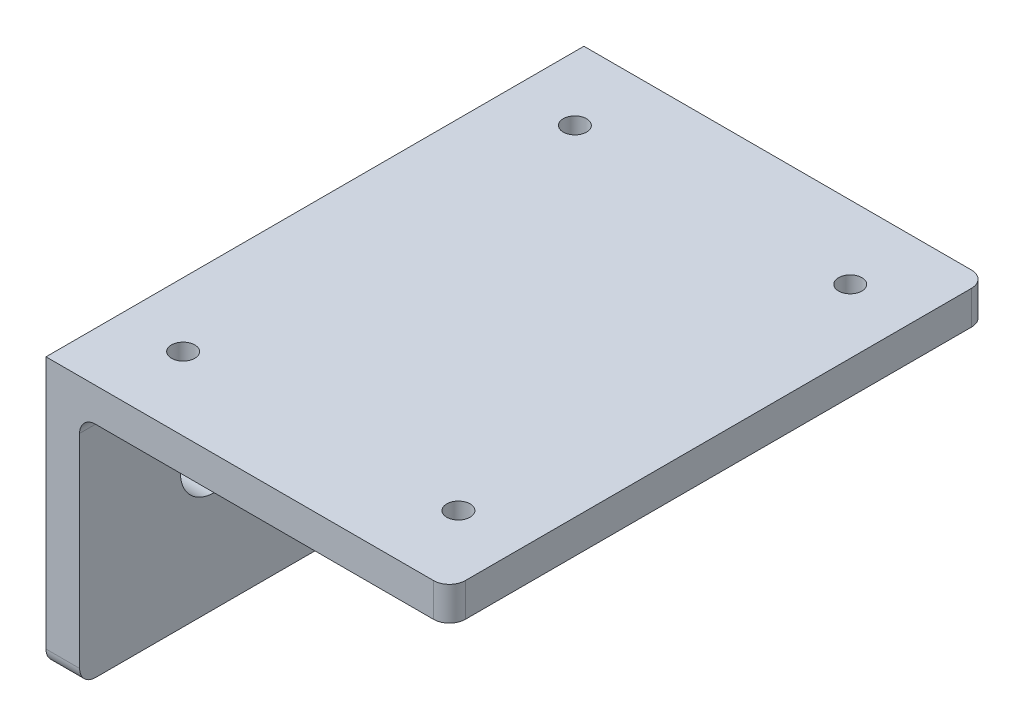
ISO-10303-21;
HEADER;
FILE_DESCRIPTION(('STEP AP214'),'2;1');
FILE_NAME('part.step','',(''),(''),'','','');
FILE_SCHEMA(('AUTOMOTIVE_DESIGN { 1 0 10303 214 1 1 1 1 }'));
ENDSEC;
DATA;
#1=APPLICATION_CONTEXT('core data for automotive mechanical design processes');
#2=APPLICATION_PROTOCOL_DEFINITION('international standard','automotive_design',2000,#1);
#3=PRODUCT_CONTEXT('',#1,'mechanical');
#4=PRODUCT('Part','Part','',(#3));
#5=PRODUCT_RELATED_PRODUCT_CATEGORY('part','',(#4));
#6=PRODUCT_DEFINITION_FORMATION('','',#4);
#7=PRODUCT_DEFINITION_CONTEXT('part definition',#1,'design');
#8=PRODUCT_DEFINITION('design','',#6,#7);
#9=PRODUCT_DEFINITION_SHAPE('','',#8);
#10=(LENGTH_UNIT() NAMED_UNIT(*) SI_UNIT(.MILLI.,.METRE.));
#11=(NAMED_UNIT(*) PLANE_ANGLE_UNIT() SI_UNIT($,.RADIAN.));
#12=(NAMED_UNIT(*) SI_UNIT($,.STERADIAN.) SOLID_ANGLE_UNIT());
#13=UNCERTAINTY_MEASURE_WITH_UNIT(LENGTH_MEASURE(1.E-05),#10,'distance_accuracy_value','');
#14=(GEOMETRIC_REPRESENTATION_CONTEXT(3) GLOBAL_UNCERTAINTY_ASSIGNED_CONTEXT((#13)) GLOBAL_UNIT_ASSIGNED_CONTEXT((#10,
#11,#12)) REPRESENTATION_CONTEXT('',''));
#15=CARTESIAN_POINT('',(0.,0.,0.));
#16=DIRECTION('',(0.,0.,1.));
#17=DIRECTION('',(1.,0.,0.));
#18=AXIS2_PLACEMENT_3D('',#15,#16,#17);
#19=CARTESIAN_POINT('',(3.175,0.,0.));
#20=DIRECTION('',(-1.,0.,0.));
#21=DIRECTION('',(0.,0.,1.));
#22=AXIS2_PLACEMENT_3D('',#19,#20,#21);
#23=PLANE('',#22);
#24=CARTESIAN_POINT('',(3.175,0.,12.7));
#25=DIRECTION('',(-1.,0.,0.));
#26=DIRECTION('',(0.,0.,1.));
#27=AXIS2_PLACEMENT_3D('',#24,#25,#26);
#28=CIRCLE('',#27,3.175);
#29=CARTESIAN_POINT('',(3.175,0.,15.875));
#30=VERTEX_POINT('',#29);
#31=EDGE_CURVE('E260',#30,#30,#28,.T.);
#32=ORIENTED_EDGE('',*,*,#31,.T.);
#33=EDGE_LOOP('',(#32));
#34=FACE_BOUND('',#33,.T.);
#35=DIRECTION('',(0.,-1.,0.));
#36=VECTOR('',#35,1.);
#37=CARTESIAN_POINT('',(3.175,-12.7,25.4));
#38=LINE('',#37,#36);
#39=CARTESIAN_POINT('',(3.175,8.02500000000001,25.4));
#40=VERTEX_POINT('',#39);
#41=CARTESIAN_POINT('',(3.175,-11.2,25.4));
#42=VERTEX_POINT('',#41);
#43=EDGE_CURVE('E304',#40,#42,#38,.T.);
#44=ORIENTED_EDGE('',*,*,#43,.T.);
#45=CARTESIAN_POINT('',(3.175,-11.2,23.9));
#46=DIRECTION('',(-1.,0.,0.));
#47=DIRECTION('',(0.,0.,1.));
#48=AXIS2_PLACEMENT_3D('',#45,#46,#47);
#49=CIRCLE('',#48,1.5);
#50=CARTESIAN_POINT('',(3.175,-12.7,23.9));
#51=VERTEX_POINT('',#50);
#52=EDGE_CURVE('E343',#42,#51,#49,.F.);
#53=ORIENTED_EDGE('',*,*,#52,.T.);
#54=DIRECTION('',(0.,0.,-1.));
#55=VECTOR('',#54,1.);
#56=CARTESIAN_POINT('',(3.175,-12.7,25.4));
#57=LINE('',#56,#55);
#58=CARTESIAN_POINT('',(3.175,-12.7,3.0875));
#59=VERTEX_POINT('',#58);
#60=EDGE_CURVE('E309',#51,#59,#57,.T.);
#61=ORIENTED_EDGE('',*,*,#60,.T.);
#62=DIRECTION('',(0.,-1.,0.));
#63=VECTOR('',#62,1.);
#64=CARTESIAN_POINT('',(3.175,9.52500000000001,3.0875));
#65=LINE('',#64,#63);
#66=CARTESIAN_POINT('',(3.175,8.02500000000001,3.0875));
#67=VERTEX_POINT('',#66);
#68=EDGE_CURVE('E339',#59,#67,#65,.F.);
#69=ORIENTED_EDGE('',*,*,#68,.T.);
#70=DIRECTION('',(0.,0.,-1.));
#71=VECTOR('',#70,1.);
#72=CARTESIAN_POINT('',(3.175,8.02500000000001,25.4));
#73=LINE('',#72,#71);
#74=EDGE_CURVE('E341',#67,#40,#73,.F.);
#75=ORIENTED_EDGE('',*,*,#74,.T.);
#76=EDGE_LOOP('',(#44,#53,#61,#69,#75));
#77=FACE_BOUND('',#76,.T.);
#78=ADVANCED_FACE('F32',(#34,#77),#23,.F.);
#79=CARTESIAN_POINT('',(0.,9.52500000000001,0.));
#80=DIRECTION('',(0.,1.,0.));
#81=DIRECTION('',(0.,0.,1.));
#82=AXIS2_PLACEMENT_3D('',#79,#80,#81);
#83=PLANE('',#82);
#84=CARTESIAN_POINT('',(32.05,9.52500000000001,-18.5));
#85=DIRECTION('',(0.,1.,0.));
#86=DIRECTION('',(0.,0.,1.));
#87=AXIS2_PLACEMENT_3D('',#84,#85,#86);
#88=CIRCLE('',#87,1.1);
#89=CARTESIAN_POINT('',(32.05,9.52500000000001,-17.4));
#90=VERTEX_POINT('',#89);
#91=EDGE_CURVE('E283',#90,#90,#88,.T.);
#92=ORIENTED_EDGE('',*,*,#91,.T.);
#93=EDGE_LOOP('',(#92));
#94=FACE_BOUND('',#93,.T.);
#95=CARTESIAN_POINT('',(6.05000000000001,9.52500000000001,18.5));
#96=DIRECTION('',(0.,1.,0.));
#97=DIRECTION('',(0.,0.,1.));
#98=AXIS2_PLACEMENT_3D('',#95,#96,#97);
#99=CIRCLE('',#98,1.1);
#100=CARTESIAN_POINT('',(6.05000000000001,9.52500000000001,19.6));
#101=VERTEX_POINT('',#100);
#102=EDGE_CURVE('E265',#101,#101,#99,.T.);
#103=ORIENTED_EDGE('',*,*,#102,.T.);
#104=EDGE_LOOP('',(#103));
#105=FACE_BOUND('',#104,.T.);
#106=CARTESIAN_POINT('',(32.05,9.52500000000001,18.5));
#107=DIRECTION('',(0.,1.,0.));
#108=DIRECTION('',(0.,0.,1.));
#109=AXIS2_PLACEMENT_3D('',#106,#107,#108);
#110=CIRCLE('',#109,1.1);
#111=CARTESIAN_POINT('',(32.05,9.52500000000001,19.6));
#112=VERTEX_POINT('',#111);
#113=EDGE_CURVE('E278',#112,#112,#110,.T.);
#114=ORIENTED_EDGE('',*,*,#113,.T.);
#115=EDGE_LOOP('',(#114));
#116=FACE_BOUND('',#115,.T.);
#117=CARTESIAN_POINT('',(6.05000000000001,9.52500000000001,-18.5));
#118=DIRECTION('',(0.,1.,0.));
#119=DIRECTION('',(0.,0.,1.));
#120=AXIS2_PLACEMENT_3D('',#117,#118,#119);
#121=CIRCLE('',#120,1.1);
#122=CARTESIAN_POINT('',(6.05000000000001,9.52500000000001,-17.4));
#123=VERTEX_POINT('',#122);
#124=EDGE_CURVE('E271',#123,#123,#121,.T.);
#125=ORIENTED_EDGE('',*,*,#124,.T.);
#126=EDGE_LOOP('',(#125));
#127=FACE_BOUND('',#126,.T.);
#128=DIRECTION('',(0.,0.,-1.));
#129=VECTOR('',#128,1.);
#130=CARTESIAN_POINT('',(38.1,9.52500000000001,-25.4));
#131=LINE('',#130,#129);
#132=CARTESIAN_POINT('',(38.1,9.52500000000001,23.9));
#133=VERTEX_POINT('',#132);
#134=CARTESIAN_POINT('',(38.1,9.52500000000001,-23.9));
#135=VERTEX_POINT('',#134);
#136=EDGE_CURVE('E292',#133,#135,#131,.T.);
#137=ORIENTED_EDGE('',*,*,#136,.F.);
#138=CARTESIAN_POINT('',(36.6,9.52500000000001,23.9));
#139=DIRECTION('',(0.,1.,0.));
#140=DIRECTION('',(0.,0.,1.));
#141=AXIS2_PLACEMENT_3D('',#138,#139,#140);
#142=CIRCLE('',#141,1.5);
#143=CARTESIAN_POINT('',(36.6,9.52500000000001,25.4));
#144=VERTEX_POINT('',#143);
#145=EDGE_CURVE('E374',#133,#144,#142,.F.);
#146=ORIENTED_EDGE('',*,*,#145,.T.);
#147=DIRECTION('',(1.,0.,0.));
#148=VECTOR('',#147,1.);
#149=CARTESIAN_POINT('',(0.,9.52500000000001,25.4));
#150=LINE('',#149,#148);
#151=CARTESIAN_POINT('',(4.675,9.52500000000001,25.4));
#152=VERTEX_POINT('',#151);
#153=EDGE_CURVE('E289',#152,#144,#150,.T.);
#154=ORIENTED_EDGE('',*,*,#153,.F.);
#155=DIRECTION('',(0.,0.,-1.));
#156=VECTOR('',#155,1.);
#157=CARTESIAN_POINT('',(4.675,9.52500000000001,1.5875));
#158=LINE('',#157,#156);
#159=CARTESIAN_POINT('',(4.675,9.52500000000001,3.0875));
#160=VERTEX_POINT('',#159);
#161=EDGE_CURVE('E366',#152,#160,#158,.T.);
#162=ORIENTED_EDGE('',*,*,#161,.T.);
#163=DIRECTION('',(-1.,0.,0.));
#164=VECTOR('',#163,1.);
#165=CARTESIAN_POINT('',(25.3999999999999,9.52500000000001,3.0875));
#166=LINE('',#165,#164);
#167=CARTESIAN_POINT('',(26.0213203435596,9.52500000000001,3.0875));
#168=VERTEX_POINT('',#167);
#169=EDGE_CURVE('E196',#160,#168,#166,.F.);
#170=ORIENTED_EDGE('',*,*,#169,.T.);
#171=DIRECTION('',(0.,0.,-1.));
#172=VECTOR('',#171,1.);
#173=CARTESIAN_POINT('',(26.0213203435596,9.52500000000001,-1.5875));
#174=LINE('',#173,#172);
#175=CARTESIAN_POINT('',(26.0213203435596,9.52500000000001,-3.0875));
#176=VERTEX_POINT('',#175);
#177=EDGE_CURVE('E246',#168,#176,#174,.T.);
#178=ORIENTED_EDGE('',*,*,#177,.T.);
#179=DIRECTION('',(-1.,0.,0.));
#180=VECTOR('',#179,1.);
#181=CARTESIAN_POINT('',(0.,9.52500000000001,-3.0875));
#182=LINE('',#181,#180);
#183=CARTESIAN_POINT('',(4.675,9.52500000000001,-3.0875));
#184=VERTEX_POINT('',#183);
#185=EDGE_CURVE('E222',#176,#184,#182,.T.);
#186=ORIENTED_EDGE('',*,*,#185,.T.);
#187=DIRECTION('',(0.,0.,-1.));
#188=VECTOR('',#187,1.);
#189=CARTESIAN_POINT('',(4.675,9.52500000000001,-25.4));
#190=LINE('',#189,#188);
#191=CARTESIAN_POINT('',(4.675,9.52500000000001,-25.4));
#192=VERTEX_POINT('',#191);
#193=EDGE_CURVE('E370',#184,#192,#190,.T.);
#194=ORIENTED_EDGE('',*,*,#193,.T.);
#195=DIRECTION('',(-1.,0.,0.));
#196=VECTOR('',#195,1.);
#197=CARTESIAN_POINT('',(0.,9.52500000000001,-25.4));
#198=LINE('',#197,#196);
#199=CARTESIAN_POINT('',(36.6,9.52500000000001,-25.4));
#200=VERTEX_POINT('',#199);
#201=EDGE_CURVE('E295',#200,#192,#198,.T.);
#202=ORIENTED_EDGE('',*,*,#201,.F.);
#203=CARTESIAN_POINT('',(36.6,9.52500000000001,-23.9));
#204=DIRECTION('',(0.,1.,0.));
#205=DIRECTION('',(0.,0.,1.));
#206=AXIS2_PLACEMENT_3D('',#203,#204,#205);
#207=CIRCLE('',#206,1.5);
#208=EDGE_CURVE('E372',#200,#135,#207,.F.);
#209=ORIENTED_EDGE('',*,*,#208,.T.);
#210=EDGE_LOOP('',(#137,#146,#154,#162,#170,#178,#186,#194,#202,#209));
#211=FACE_BOUND('',#210,.T.);
#212=ADVANCED_FACE('F379',(#94,#105,#116,#127,#211),#83,.F.);
#213=CARTESIAN_POINT('',(3.175,0.,-12.7));
#214=DIRECTION('',(-1.,0.,0.));
#215=DIRECTION('',(0.,0.,1.));
#216=AXIS2_PLACEMENT_3D('',#213,#214,#215);
#217=CIRCLE('',#216,3.175);
#218=CARTESIAN_POINT('',(3.175,0.,-9.525));
#219=VERTEX_POINT('',#218);
#220=EDGE_CURVE('E253',#219,#219,#217,.T.);
#221=ORIENTED_EDGE('',*,*,#220,.T.);
#222=EDGE_LOOP('',(#221));
#223=FACE_BOUND('',#222,.T.);
#224=CARTESIAN_POINT('',(3.175,-12.7,-3.0875));
#225=VERTEX_POINT('',#224);
#226=CARTESIAN_POINT('',(3.175,-12.7,-23.9));
#227=VERTEX_POINT('',#226);
#228=EDGE_CURVE('E308',#225,#227,#57,.T.);
#229=ORIENTED_EDGE('',*,*,#228,.T.);
#230=CARTESIAN_POINT('',(3.175,-11.2,-23.9));
#231=DIRECTION('',(-1.,0.,0.));
#232=DIRECTION('',(0.,0.,1.));
#233=AXIS2_PLACEMENT_3D('',#230,#231,#232);
#234=CIRCLE('',#233,1.5);
#235=CARTESIAN_POINT('',(3.175,-11.2,-25.4));
#236=VERTEX_POINT('',#235);
#237=EDGE_CURVE('E354',#227,#236,#234,.F.);
#238=ORIENTED_EDGE('',*,*,#237,.T.);
#239=DIRECTION('',(0.,1.,0.));
#240=VECTOR('',#239,1.);
#241=CARTESIAN_POINT('',(3.175,-12.7,-25.4));
#242=LINE('',#241,#240);
#243=CARTESIAN_POINT('',(3.175,8.02500000000001,-25.4));
#244=VERTEX_POINT('',#243);
#245=EDGE_CURVE('E301',#236,#244,#242,.T.);
#246=ORIENTED_EDGE('',*,*,#245,.T.);
#247=DIRECTION('',(0.,0.,-1.));
#248=VECTOR('',#247,1.);
#249=CARTESIAN_POINT('',(3.175,8.02500000000001,-1.5875));
#250=LINE('',#249,#248);
#251=CARTESIAN_POINT('',(3.175,8.02500000000001,-3.0875));
#252=VERTEX_POINT('',#251);
#253=EDGE_CURVE('E350',#244,#252,#250,.F.);
#254=ORIENTED_EDGE('',*,*,#253,.T.);
#255=DIRECTION('',(0.,-1.,0.));
#256=VECTOR('',#255,1.);
#257=CARTESIAN_POINT('',(3.175,0.,-3.0875));
#258=LINE('',#257,#256);
#259=EDGE_CURVE('E352',#252,#225,#258,.T.);
#260=ORIENTED_EDGE('',*,*,#259,.T.);
#261=EDGE_LOOP('',(#229,#238,#246,#254,#260));
#262=FACE_BOUND('',#261,.T.);
#263=ADVANCED_FACE('F424',(#223,#262),#23,.F.);
#264=CARTESIAN_POINT('',(3.175,-12.7,-25.4));
#265=DIRECTION('',(0.,0.,1.));
#266=DIRECTION('',(1.,0.,0.));
#267=AXIS2_PLACEMENT_3D('',#264,#265,#266);
#268=PLANE('',#267);
#269=ORIENTED_EDGE('',*,*,#245,.F.);
#270=DIRECTION('',(-1.,0.,0.));
#271=VECTOR('',#270,1.);
#272=CARTESIAN_POINT('',(3.175,-11.2,-25.4));
#273=LINE('',#272,#271);
#274=CARTESIAN_POINT('',(0.,-11.2,-25.4));
#275=VERTEX_POINT('',#274);
#276=EDGE_CURVE('E347',#236,#275,#273,.T.);
#277=ORIENTED_EDGE('',*,*,#276,.T.);
#278=DIRECTION('',(0.,1.,0.));
#279=VECTOR('',#278,1.);
#280=CARTESIAN_POINT('',(0.,-12.7,-25.4));
#281=LINE('',#280,#279);
#282=CARTESIAN_POINT('',(0.,12.7,-25.4));
#283=VERTEX_POINT('',#282);
#284=EDGE_CURVE('E298',#275,#283,#281,.T.);
#285=ORIENTED_EDGE('',*,*,#284,.T.);
#286=DIRECTION('',(-1.,0.,0.));
#287=VECTOR('',#286,1.);
#288=CARTESIAN_POINT('',(3.175,12.7,-25.4));
#289=LINE('',#288,#287);
#290=CARTESIAN_POINT('',(36.6,12.7,-25.4));
#291=VERTEX_POINT('',#290);
#292=EDGE_CURVE('E323',#291,#283,#289,.T.);
#293=ORIENTED_EDGE('',*,*,#292,.F.);
#294=DIRECTION('',(0.,1.,0.));
#295=VECTOR('',#294,1.);
#296=CARTESIAN_POINT('',(36.6,9.52500000000001,-25.4));
#297=LINE('',#296,#295);
#298=EDGE_CURVE('E345',#291,#200,#297,.F.);
#299=ORIENTED_EDGE('',*,*,#298,.T.);
#300=ORIENTED_EDGE('',*,*,#201,.T.);
#301=CARTESIAN_POINT('',(4.675,8.02500000000001,-25.4));
#302=DIRECTION('',(0.,0.,1.));
#303=DIRECTION('',(1.,0.,0.));
#304=AXIS2_PLACEMENT_3D('',#301,#302,#303);
#305=CIRCLE('',#304,1.5);
#306=EDGE_CURVE('E236',#192,#244,#305,.T.);
#307=ORIENTED_EDGE('',*,*,#306,.T.);
#308=EDGE_LOOP('',(#269,#277,#285,#293,#299,#300,#307));
#309=FACE_BOUND('',#308,.T.);
#310=ADVANCED_FACE('F404',(#309),#268,.F.);
#311=CARTESIAN_POINT('',(3.175,12.7,25.4));
#312=DIRECTION('',(0.,-1.,0.));
#313=DIRECTION('',(0.,0.,-1.));
#314=AXIS2_PLACEMENT_3D('',#311,#312,#313);
#315=PLANE('',#314);
#316=CARTESIAN_POINT('',(6.05000000000001,12.7,-18.5));
#317=DIRECTION('',(0.,1.,0.));
#318=DIRECTION('',(0.,0.,1.));
#319=AXIS2_PLACEMENT_3D('',#316,#317,#318);
#320=CIRCLE('',#319,1.1);
#321=CARTESIAN_POINT('',(6.05000000000001,12.7,-17.4));
#322=VERTEX_POINT('',#321);
#323=EDGE_CURVE('E275',#322,#322,#320,.T.);
#324=ORIENTED_EDGE('',*,*,#323,.F.);
#325=EDGE_LOOP('',(#324));
#326=FACE_BOUND('',#325,.T.);
#327=CARTESIAN_POINT('',(32.05,12.7,18.5));
#328=DIRECTION('',(0.,1.,0.));
#329=DIRECTION('',(0.,0.,1.));
#330=AXIS2_PLACEMENT_3D('',#327,#328,#329);
#331=CIRCLE('',#330,1.1);
#332=CARTESIAN_POINT('',(32.05,12.7,19.6));
#333=VERTEX_POINT('',#332);
#334=EDGE_CURVE('E268',#333,#333,#331,.T.);
#335=ORIENTED_EDGE('',*,*,#334,.F.);
#336=EDGE_LOOP('',(#335));
#337=FACE_BOUND('',#336,.T.);
#338=CARTESIAN_POINT('',(6.05000000000001,12.7,18.5));
#339=DIRECTION('',(0.,1.,0.));
#340=DIRECTION('',(0.,0.,1.));
#341=AXIS2_PLACEMENT_3D('',#338,#339,#340);
#342=CIRCLE('',#341,1.1);
#343=CARTESIAN_POINT('',(6.05000000000001,12.7,19.6));
#344=VERTEX_POINT('',#343);
#345=EDGE_CURVE('E256',#344,#344,#342,.T.);
#346=ORIENTED_EDGE('',*,*,#345,.F.);
#347=EDGE_LOOP('',(#346));
#348=FACE_BOUND('',#347,.T.);
#349=CARTESIAN_POINT('',(32.05,12.7,-18.5));
#350=DIRECTION('',(0.,1.,0.));
#351=DIRECTION('',(0.,0.,1.));
#352=AXIS2_PLACEMENT_3D('',#349,#350,#351);
#353=CIRCLE('',#352,1.1);
#354=CARTESIAN_POINT('',(32.05,12.7,-17.4));
#355=VERTEX_POINT('',#354);
#356=EDGE_CURVE('E274',#355,#355,#353,.T.);
#357=ORIENTED_EDGE('',*,*,#356,.F.);
#358=EDGE_LOOP('',(#357));
#359=FACE_BOUND('',#358,.T.);
#360=DIRECTION('',(-1.,0.,0.));
#361=VECTOR('',#360,1.);
#362=CARTESIAN_POINT('',(3.175,12.7,25.4));
#363=LINE('',#362,#361);
#364=CARTESIAN_POINT('',(36.6,12.7,25.4));
#365=VERTEX_POINT('',#364);
#366=CARTESIAN_POINT('',(0.,12.7,25.4));
#367=VERTEX_POINT('',#366);
#368=EDGE_CURVE('E311',#365,#367,#363,.T.);
#369=ORIENTED_EDGE('',*,*,#368,.F.);
#370=CARTESIAN_POINT('',(36.6,12.7,23.9));
#371=DIRECTION('',(0.,-1.,0.));
#372=DIRECTION('',(0.,0.,-1.));
#373=AXIS2_PLACEMENT_3D('',#370,#371,#372);
#374=CIRCLE('',#373,1.5);
#375=CARTESIAN_POINT('',(38.1,12.7,23.9));
#376=VERTEX_POINT('',#375);
#377=EDGE_CURVE('E358',#365,#376,#374,.F.);
#378=ORIENTED_EDGE('',*,*,#377,.T.);
#379=DIRECTION('',(0.,0.,-1.));
#380=VECTOR('',#379,1.);
#381=CARTESIAN_POINT('',(38.1,12.7,-25.4));
#382=LINE('',#381,#380);
#383=CARTESIAN_POINT('',(38.1,12.7,-23.9));
#384=VERTEX_POINT('',#383);
#385=EDGE_CURVE('E286',#376,#384,#382,.T.);
#386=ORIENTED_EDGE('',*,*,#385,.T.);
#387=CARTESIAN_POINT('',(36.6,12.7,-23.9));
#388=DIRECTION('',(0.,-1.,0.));
#389=DIRECTION('',(0.,0.,-1.));
#390=AXIS2_PLACEMENT_3D('',#387,#388,#389);
#391=CIRCLE('',#390,1.5);
#392=EDGE_CURVE('E356',#384,#291,#391,.F.);
#393=ORIENTED_EDGE('',*,*,#392,.T.);
#394=ORIENTED_EDGE('',*,*,#292,.T.);
#395=DIRECTION('',(0.,0.,1.));
#396=VECTOR('',#395,1.);
#397=CARTESIAN_POINT('',(0.,12.7,25.4));
#398=LINE('',#397,#396);
#399=EDGE_CURVE('E314',#283,#367,#398,.T.);
#400=ORIENTED_EDGE('',*,*,#399,.T.);
#401=EDGE_LOOP('',(#369,#378,#386,#393,#394,#400));
#402=FACE_BOUND('',#401,.T.);
#403=ADVANCED_FACE('F392',(#326,#337,#348,#359,#402),#315,.F.);
#404=CARTESIAN_POINT('',(3.175,-12.7,25.4));
#405=DIRECTION('',(0.,0.,-1.));
#406=DIRECTION('',(-1.,0.,0.));
#407=AXIS2_PLACEMENT_3D('',#404,#405,#406);
#408=PLANE('',#407);
#409=DIRECTION('',(0.,-1.,0.));
#410=VECTOR('',#409,1.);
#411=CARTESIAN_POINT('',(0.,-12.7,25.4));
#412=LINE('',#411,#410);
#413=CARTESIAN_POINT('',(0.,-11.2,25.4));
#414=VERTEX_POINT('',#413);
#415=EDGE_CURVE('E317',#367,#414,#412,.T.);
#416=ORIENTED_EDGE('',*,*,#415,.T.);
#417=DIRECTION('',(-1.,0.,0.));
#418=VECTOR('',#417,1.);
#419=CARTESIAN_POINT('',(3.175,-11.2,25.4));
#420=LINE('',#419,#418);
#421=EDGE_CURVE('E337',#414,#42,#420,.F.);
#422=ORIENTED_EDGE('',*,*,#421,.T.);
#423=ORIENTED_EDGE('',*,*,#43,.F.);
#424=CARTESIAN_POINT('',(4.675,8.02500000000001,25.4));
#425=DIRECTION('',(0.,0.,-1.));
#426=DIRECTION('',(-1.,0.,0.));
#427=AXIS2_PLACEMENT_3D('',#424,#425,#426);
#428=CIRCLE('',#427,1.5);
#429=EDGE_CURVE('E238',#40,#152,#428,.T.);
#430=ORIENTED_EDGE('',*,*,#429,.T.);
#431=ORIENTED_EDGE('',*,*,#153,.T.);
#432=DIRECTION('',(0.,1.,0.));
#433=VECTOR('',#432,1.);
#434=CARTESIAN_POINT('',(36.6,12.7,25.4));
#435=LINE('',#434,#433);
#436=EDGE_CURVE('E334',#144,#365,#435,.T.);
#437=ORIENTED_EDGE('',*,*,#436,.T.);
#438=ORIENTED_EDGE('',*,*,#368,.T.);
#439=EDGE_LOOP('',(#416,#422,#423,#430,#431,#437,#438));
#440=FACE_BOUND('',#439,.T.);
#441=ADVANCED_FACE('F385',(#440),#408,.F.);
#442=CARTESIAN_POINT('',(3.175,-12.7,25.4));
#443=DIRECTION('',(0.,1.,0.));
#444=DIRECTION('',(0.,0.,1.));
#445=AXIS2_PLACEMENT_3D('',#442,#443,#444);
#446=PLANE('',#445);
#447=ORIENTED_EDGE('',*,*,#60,.F.);
#448=DIRECTION('',(-1.,0.,0.));
#449=VECTOR('',#448,1.);
#450=CARTESIAN_POINT('',(3.175,-12.7,23.9));
#451=LINE('',#450,#449);
#452=CARTESIAN_POINT('',(0.,-12.7,23.9));
#453=VERTEX_POINT('',#452);
#454=EDGE_CURVE('E328',#51,#453,#451,.T.);
#455=ORIENTED_EDGE('',*,*,#454,.T.);
#456=DIRECTION('',(0.,0.,-1.));
#457=VECTOR('',#456,1.);
#458=CARTESIAN_POINT('',(0.,-12.7,25.4));
#459=LINE('',#458,#457);
#460=CARTESIAN_POINT('',(0.,-12.7,-23.9));
#461=VERTEX_POINT('',#460);
#462=EDGE_CURVE('E305',#453,#461,#459,.T.);
#463=ORIENTED_EDGE('',*,*,#462,.T.);
#464=DIRECTION('',(-1.,0.,0.));
#465=VECTOR('',#464,1.);
#466=CARTESIAN_POINT('',(3.175,-12.7,-23.9));
#467=LINE('',#466,#465);
#468=EDGE_CURVE('E326',#461,#227,#467,.F.);
#469=ORIENTED_EDGE('',*,*,#468,.T.);
#470=ORIENTED_EDGE('',*,*,#228,.F.);
#471=DIRECTION('',(0.,0.,-1.));
#472=VECTOR('',#471,1.);
#473=CARTESIAN_POINT('',(3.175,-12.7,1.5875));
#474=LINE('',#473,#472);
#475=EDGE_CURVE('E49',#59,#225,#474,.T.);
#476=ORIENTED_EDGE('',*,*,#475,.F.);
#477=EDGE_LOOP('',(#447,#455,#463,#469,#470,#476));
#478=FACE_BOUND('',#477,.T.);
#479=ADVANCED_FACE('F417',(#478),#446,.F.);
#480=CARTESIAN_POINT('',(0.,0.,0.));
#481=DIRECTION('',(-1.,0.,0.));
#482=DIRECTION('',(0.,0.,1.));
#483=AXIS2_PLACEMENT_3D('',#480,#481,#482);
#484=PLANE('',#483);
#485=CARTESIAN_POINT('',(0.,0.,-12.7));
#486=DIRECTION('',(-1.,0.,0.));
#487=DIRECTION('',(0.,0.,1.));
#488=AXIS2_PLACEMENT_3D('',#485,#486,#487);
#489=CIRCLE('',#488,3.175);
#490=CARTESIAN_POINT('',(0.,0.,-9.525));
#491=VERTEX_POINT('',#490);
#492=EDGE_CURVE('E257',#491,#491,#489,.T.);
#493=ORIENTED_EDGE('',*,*,#492,.F.);
#494=EDGE_LOOP('',(#493));
#495=FACE_BOUND('',#494,.T.);
#496=CARTESIAN_POINT('',(0.,0.,12.7));
#497=DIRECTION('',(-1.,0.,0.));
#498=DIRECTION('',(0.,0.,1.));
#499=AXIS2_PLACEMENT_3D('',#496,#497,#498);
#500=CIRCLE('',#499,3.175);
#501=CARTESIAN_POINT('',(0.,0.,15.875));
#502=VERTEX_POINT('',#501);
#503=EDGE_CURVE('E249',#502,#502,#500,.T.);
#504=ORIENTED_EDGE('',*,*,#503,.F.);
#505=EDGE_LOOP('',(#504));
#506=FACE_BOUND('',#505,.T.);
#507=ORIENTED_EDGE('',*,*,#462,.F.);
#508=CARTESIAN_POINT('',(0.,-11.2,23.9));
#509=DIRECTION('',(-1.,0.,0.));
#510=DIRECTION('',(0.,0.,1.));
#511=AXIS2_PLACEMENT_3D('',#508,#509,#510);
#512=CIRCLE('',#511,1.5);
#513=EDGE_CURVE('E332',#453,#414,#512,.T.);
#514=ORIENTED_EDGE('',*,*,#513,.T.);
#515=ORIENTED_EDGE('',*,*,#415,.F.);
#516=ORIENTED_EDGE('',*,*,#399,.F.);
#517=ORIENTED_EDGE('',*,*,#284,.F.);
#518=CARTESIAN_POINT('',(0.,-11.2,-23.9));
#519=DIRECTION('',(-1.,0.,0.));
#520=DIRECTION('',(0.,0.,1.));
#521=AXIS2_PLACEMENT_3D('',#518,#519,#520);
#522=CIRCLE('',#521,1.5);
#523=EDGE_CURVE('E78',#275,#461,#522,.T.);
#524=ORIENTED_EDGE('',*,*,#523,.T.);
#525=EDGE_LOOP('',(#507,#514,#515,#516,#517,#524));
#526=FACE_BOUND('',#525,.T.);
#527=ADVANCED_FACE('F410',(#495,#506,#526),#484,.T.);
#528=CARTESIAN_POINT('',(38.1,9.52500000000001,-25.4));
#529=DIRECTION('',(1.,0.,0.));
#530=DIRECTION('',(0.,0.,-1.));
#531=AXIS2_PLACEMENT_3D('',#528,#529,#530);
#532=PLANE('',#531);
#533=ORIENTED_EDGE('',*,*,#385,.F.);
#534=DIRECTION('',(0.,1.,0.));
#535=VECTOR('',#534,1.);
#536=CARTESIAN_POINT('',(38.1,9.52500000000001,23.9));
#537=LINE('',#536,#535);
#538=EDGE_CURVE('E363',#376,#133,#537,.F.);
#539=ORIENTED_EDGE('',*,*,#538,.T.);
#540=ORIENTED_EDGE('',*,*,#136,.T.);
#541=DIRECTION('',(0.,1.,0.));
#542=VECTOR('',#541,1.);
#543=CARTESIAN_POINT('',(38.1,12.7,-23.9));
#544=LINE('',#543,#542);
#545=EDGE_CURVE('E360',#135,#384,#544,.T.);
#546=ORIENTED_EDGE('',*,*,#545,.T.);
#547=EDGE_LOOP('',(#533,#539,#540,#546));
#548=FACE_BOUND('',#547,.T.);
#549=ADVANCED_FACE('F394',(#548),#532,.T.);
#550=CARTESIAN_POINT('',(32.05,9.52500000000001,-18.5));
#551=DIRECTION('',(0.,1.,0.));
#552=DIRECTION('',(0.,0.,1.));
#553=AXIS2_PLACEMENT_3D('',#550,#551,#552);
#554=CYLINDRICAL_SURFACE('',#553,1.1);
#555=ORIENTED_EDGE('',*,*,#91,.F.);
#556=EDGE_LOOP('',(#555));
#557=FACE_BOUND('',#556,.T.);
#558=ORIENTED_EDGE('',*,*,#356,.T.);
#559=EDGE_LOOP('',(#558));
#560=FACE_BOUND('',#559,.T.);
#561=ADVANCED_FACE('F486',(#557,#560),#554,.F.);
#562=CARTESIAN_POINT('',(6.05000000000001,9.52500000000001,18.5));
#563=DIRECTION('',(0.,1.,0.));
#564=DIRECTION('',(0.,0.,1.));
#565=AXIS2_PLACEMENT_3D('',#562,#563,#564);
#566=CYLINDRICAL_SURFACE('',#565,1.1);
#567=ORIENTED_EDGE('',*,*,#102,.F.);
#568=EDGE_LOOP('',(#567));
#569=FACE_BOUND('',#568,.T.);
#570=ORIENTED_EDGE('',*,*,#345,.T.);
#571=EDGE_LOOP('',(#570));
#572=FACE_BOUND('',#571,.T.);
#573=ADVANCED_FACE('F484',(#569,#572),#566,.F.);
#574=CARTESIAN_POINT('',(32.05,9.52500000000001,18.5));
#575=DIRECTION('',(0.,1.,0.));
#576=DIRECTION('',(0.,0.,1.));
#577=AXIS2_PLACEMENT_3D('',#574,#575,#576);
#578=CYLINDRICAL_SURFACE('',#577,1.1);
#579=ORIENTED_EDGE('',*,*,#113,.F.);
#580=EDGE_LOOP('',(#579));
#581=FACE_BOUND('',#580,.T.);
#582=ORIENTED_EDGE('',*,*,#334,.T.);
#583=EDGE_LOOP('',(#582));
#584=FACE_BOUND('',#583,.T.);
#585=ADVANCED_FACE('F479',(#581,#584),#578,.F.);
#586=CARTESIAN_POINT('',(6.05000000000001,9.52500000000001,-18.5));
#587=DIRECTION('',(0.,1.,0.));
#588=DIRECTION('',(0.,0.,1.));
#589=AXIS2_PLACEMENT_3D('',#586,#587,#588);
#590=CYLINDRICAL_SURFACE('',#589,1.1);
#591=ORIENTED_EDGE('',*,*,#124,.F.);
#592=EDGE_LOOP('',(#591));
#593=FACE_BOUND('',#592,.T.);
#594=ORIENTED_EDGE('',*,*,#323,.T.);
#595=EDGE_LOOP('',(#594));
#596=FACE_BOUND('',#595,.T.);
#597=ADVANCED_FACE('F473',(#593,#596),#590,.F.);
#598=CARTESIAN_POINT('',(3.175,0.,12.7));
#599=DIRECTION('',(-1.,0.,0.));
#600=DIRECTION('',(0.,0.,1.));
#601=AXIS2_PLACEMENT_3D('',#598,#599,#600);
#602=CYLINDRICAL_SURFACE('',#601,3.175);
#603=ORIENTED_EDGE('',*,*,#31,.F.);
#604=EDGE_LOOP('',(#603));
#605=FACE_BOUND('',#604,.T.);
#606=ORIENTED_EDGE('',*,*,#503,.T.);
#607=EDGE_LOOP('',(#606));
#608=FACE_BOUND('',#607,.T.);
#609=ADVANCED_FACE('F464',(#605,#608),#602,.F.);
#610=CARTESIAN_POINT('',(3.175,0.,-12.7));
#611=DIRECTION('',(-1.,0.,0.));
#612=DIRECTION('',(0.,0.,1.));
#613=AXIS2_PLACEMENT_3D('',#610,#611,#612);
#614=CYLINDRICAL_SURFACE('',#613,3.175);
#615=ORIENTED_EDGE('',*,*,#220,.F.);
#616=EDGE_LOOP('',(#615));
#617=FACE_BOUND('',#616,.T.);
#618=ORIENTED_EDGE('',*,*,#492,.T.);
#619=EDGE_LOOP('',(#618));
#620=FACE_BOUND('',#619,.T.);
#621=ADVANCED_FACE('F461',(#617,#620),#614,.F.);
#622=CARTESIAN_POINT('',(3.175,-12.7,1.5875));
#623=DIRECTION('',(-0.707106781186549,0.707106781186546,0.));
#624=DIRECTION('',(-0.707106781186546,-0.707106781186549,0.));
#625=AXIS2_PLACEMENT_3D('',#622,#623,#624);
#626=PLANE('',#625);
#627=DIRECTION('',(0.707106781186546,0.707106781186549,0.));
#628=VECTOR('',#627,1.);
#629=CARTESIAN_POINT('',(3.175,-12.7,-1.5875));
#630=LINE('',#629,#628);
#631=CARTESIAN_POINT('',(4.675,-11.2,-1.5875));
#632=VERTEX_POINT('',#631);
#633=CARTESIAN_POINT('',(23.8999999999999,8.025,-1.5875));
#634=VERTEX_POINT('',#633);
#635=EDGE_CURVE('E193',#632,#634,#630,.T.);
#636=ORIENTED_EDGE('',*,*,#635,.T.);
#637=CARTESIAN_POINT('',(23.8999999999999,8.02500000000001,-3.0875));
#638=DIRECTION('',(-0.707106781186549,0.707106781186546,0.));
#639=DIRECTION('',(-0.707106781186546,-0.707106781186549,0.));
#640=AXIS2_PLACEMENT_3D('',#637,#638,#639);
#641=ELLIPSE('',#640,2.12132034355964,1.5);
#642=CARTESIAN_POINT('',(24.9606601717797,9.08566017177982,-2.02683982822018));
#643=VERTEX_POINT('',#642);
#644=EDGE_CURVE('E176',#634,#643,#641,.T.);
#645=ORIENTED_EDGE('',*,*,#644,.T.);
#646=DIRECTION('',(0.,0.,-1.));
#647=VECTOR('',#646,1.);
#648=CARTESIAN_POINT('',(24.9606601717797,9.08566017177982,1.5875));
#649=LINE('',#648,#647);
#650=CARTESIAN_POINT('',(24.9606601717797,9.08566017177982,2.02683982822018));
#651=VERTEX_POINT('',#650);
#652=EDGE_CURVE('E58',#643,#651,#649,.F.);
#653=ORIENTED_EDGE('',*,*,#652,.T.);
#654=CARTESIAN_POINT('',(23.8999999999999,8.02500000000001,3.0875));
#655=DIRECTION('',(-0.707106781186549,0.707106781186546,0.));
#656=DIRECTION('',(0.707106781186546,0.707106781186549,0.));
#657=AXIS2_PLACEMENT_3D('',#654,#655,#656);
#658=ELLIPSE('',#657,2.12132034355964,1.5);
#659=CARTESIAN_POINT('',(23.8999999999999,8.025,1.5875));
#660=VERTEX_POINT('',#659);
#661=EDGE_CURVE('E41',#651,#660,#658,.T.);
#662=ORIENTED_EDGE('',*,*,#661,.T.);
#663=DIRECTION('',(0.707106781186546,0.707106781186549,0.));
#664=VECTOR('',#663,1.);
#665=CARTESIAN_POINT('',(3.175,-12.7,1.5875));
#666=LINE('',#665,#664);
#667=CARTESIAN_POINT('',(4.675,-11.2,1.5875));
#668=VERTEX_POINT('',#667);
#669=EDGE_CURVE('E173',#668,#660,#666,.T.);
#670=ORIENTED_EDGE('',*,*,#669,.F.);
#671=CARTESIAN_POINT('',(4.675,-11.2,3.0875));
#672=DIRECTION('',(-0.707106781186549,0.707106781186546,0.));
#673=DIRECTION('',(0.707106781186546,0.707106781186549,0.));
#674=AXIS2_PLACEMENT_3D('',#671,#672,#673);
#675=ELLIPSE('',#674,2.12132034355965,1.5);
#676=EDGE_CURVE('E11',#668,#59,#675,.T.);
#677=ORIENTED_EDGE('',*,*,#676,.T.);
#678=ORIENTED_EDGE('',*,*,#475,.T.);
#679=CARTESIAN_POINT('',(4.675,-11.2,-3.0875));
#680=DIRECTION('',(-0.707106781186549,0.707106781186546,0.));
#681=DIRECTION('',(-0.707106781186546,-0.707106781186549,0.));
#682=AXIS2_PLACEMENT_3D('',#679,#680,#681);
#683=ELLIPSE('',#682,2.12132034355965,1.5);
#684=EDGE_CURVE('E234',#225,#632,#683,.T.);
#685=ORIENTED_EDGE('',*,*,#684,.T.);
#686=EDGE_LOOP('',(#636,#645,#653,#662,#670,#677,#678,#685));
#687=FACE_BOUND('',#686,.T.);
#688=ADVANCED_FACE('F247',(#687),#626,.F.);
#689=CARTESIAN_POINT('',(0.,0.,1.5875));
#690=DIRECTION('',(0.,0.,-1.));
#691=DIRECTION('',(-1.,0.,0.));
#692=AXIS2_PLACEMENT_3D('',#689,#690,#691);
#693=PLANE('',#692);
#694=ORIENTED_EDGE('',*,*,#669,.T.);
#695=DIRECTION('',(-1.,0.,0.));
#696=VECTOR('',#695,1.);
#697=CARTESIAN_POINT('',(3.175,8.02500000000001,1.5875));
#698=LINE('',#697,#696);
#699=CARTESIAN_POINT('',(4.675,8.02500000000001,1.5875));
#700=VERTEX_POINT('',#699);
#701=EDGE_CURVE('E168',#660,#700,#698,.T.);
#702=ORIENTED_EDGE('',*,*,#701,.T.);
#703=DIRECTION('',(0.,-1.,0.));
#704=VECTOR('',#703,1.);
#705=CARTESIAN_POINT('',(4.675,-12.7,1.5875));
#706=LINE('',#705,#704);
#707=EDGE_CURVE('E171',#700,#668,#706,.T.);
#708=ORIENTED_EDGE('',*,*,#707,.T.);
#709=EDGE_LOOP('',(#694,#702,#708));
#710=FACE_BOUND('',#709,.T.);
#711=ADVANCED_FACE('F170',(#710),#693,.F.);
#712=CARTESIAN_POINT('',(0.,0.,-1.5875));
#713=DIRECTION('',(0.,0.,-1.));
#714=DIRECTION('',(-1.,0.,0.));
#715=AXIS2_PLACEMENT_3D('',#712,#713,#714);
#716=PLANE('',#715);
#717=DIRECTION('',(0.,-1.,0.));
#718=VECTOR('',#717,1.);
#719=CARTESIAN_POINT('',(4.675,0.,-1.5875));
#720=LINE('',#719,#718);
#721=CARTESIAN_POINT('',(4.675,8.02500000000001,-1.5875));
#722=VERTEX_POINT('',#721);
#723=EDGE_CURVE('E228',#632,#722,#720,.F.);
#724=ORIENTED_EDGE('',*,*,#723,.T.);
#725=DIRECTION('',(-1.,0.,0.));
#726=VECTOR('',#725,1.);
#727=CARTESIAN_POINT('',(0.,8.02500000000001,-1.5875));
#728=LINE('',#727,#726);
#729=EDGE_CURVE('E184',#722,#634,#728,.F.);
#730=ORIENTED_EDGE('',*,*,#729,.T.);
#731=ORIENTED_EDGE('',*,*,#635,.F.);
#732=EDGE_LOOP('',(#724,#730,#731));
#733=FACE_BOUND('',#732,.T.);
#734=ADVANCED_FACE('F432',(#733),#716,.T.);
#735=CARTESIAN_POINT('',(3.175,-11.2,23.9));
#736=DIRECTION('',(-1.,0.,0.));
#737=DIRECTION('',(0.,0.,1.));
#738=AXIS2_PLACEMENT_3D('',#735,#736,#737);
#739=CYLINDRICAL_SURFACE('',#738,1.5);
#740=ORIENTED_EDGE('',*,*,#52,.F.);
#741=ORIENTED_EDGE('',*,*,#421,.F.);
#742=ORIENTED_EDGE('',*,*,#513,.F.);
#743=ORIENTED_EDGE('',*,*,#454,.F.);
#744=EDGE_LOOP('',(#740,#741,#742,#743));
#745=FACE_BOUND('',#744,.T.);
#746=ADVANCED_FACE('F414',(#745),#739,.T.);
#747=CARTESIAN_POINT('',(3.175,-11.2,-23.9));
#748=DIRECTION('',(-1.,0.,0.));
#749=DIRECTION('',(0.,0.,1.));
#750=AXIS2_PLACEMENT_3D('',#747,#748,#749);
#751=CYLINDRICAL_SURFACE('',#750,1.5);
#752=ORIENTED_EDGE('',*,*,#237,.F.);
#753=ORIENTED_EDGE('',*,*,#468,.F.);
#754=ORIENTED_EDGE('',*,*,#523,.F.);
#755=ORIENTED_EDGE('',*,*,#276,.F.);
#756=EDGE_LOOP('',(#752,#753,#754,#755));
#757=FACE_BOUND('',#756,.T.);
#758=ADVANCED_FACE('F422',(#757),#751,.T.);
#759=CARTESIAN_POINT('',(36.6,-12.7,23.9));
#760=DIRECTION('',(0.,-1.,0.));
#761=DIRECTION('',(0.,0.,-1.));
#762=AXIS2_PLACEMENT_3D('',#759,#760,#761);
#763=CYLINDRICAL_SURFACE('',#762,1.5);
#764=ORIENTED_EDGE('',*,*,#145,.F.);
#765=ORIENTED_EDGE('',*,*,#538,.F.);
#766=ORIENTED_EDGE('',*,*,#377,.F.);
#767=ORIENTED_EDGE('',*,*,#436,.F.);
#768=EDGE_LOOP('',(#764,#765,#766,#767));
#769=FACE_BOUND('',#768,.T.);
#770=ADVANCED_FACE('F389',(#769),#763,.T.);
#771=CARTESIAN_POINT('',(36.6,9.52500000000001,-23.9));
#772=DIRECTION('',(0.,-1.,0.));
#773=DIRECTION('',(0.,0.,-1.));
#774=AXIS2_PLACEMENT_3D('',#771,#772,#773);
#775=CYLINDRICAL_SURFACE('',#774,1.5);
#776=ORIENTED_EDGE('',*,*,#208,.F.);
#777=ORIENTED_EDGE('',*,*,#298,.F.);
#778=ORIENTED_EDGE('',*,*,#392,.F.);
#779=ORIENTED_EDGE('',*,*,#545,.F.);
#780=EDGE_LOOP('',(#776,#777,#778,#779));
#781=FACE_BOUND('',#780,.T.);
#782=ADVANCED_FACE('F398',(#781),#775,.T.);
#783=CARTESIAN_POINT('',(4.675,0.,3.0875));
#784=DIRECTION('',(0.,1.,0.));
#785=DIRECTION('',(0.,0.,1.));
#786=AXIS2_PLACEMENT_3D('',#783,#784,#785);
#787=CYLINDRICAL_SURFACE('',#786,1.5);
#788=ORIENTED_EDGE('',*,*,#676,.F.);
#789=ORIENTED_EDGE('',*,*,#707,.F.);
#790=CARTESIAN_POINT('',(4.675,8.02500000000001,3.0875));
#791=DIRECTION('',(0.,-1.,0.));
#792=DIRECTION('',(0.,0.,-1.));
#793=AXIS2_PLACEMENT_3D('',#790,#791,#792);
#794=CIRCLE('',#793,1.5);
#795=EDGE_CURVE('E36',#67,#700,#794,.T.);
#796=ORIENTED_EDGE('',*,*,#795,.F.);
#797=ORIENTED_EDGE('',*,*,#68,.F.);
#798=EDGE_LOOP('',(#788,#789,#796,#797));
#799=FACE_BOUND('',#798,.T.);
#800=ADVANCED_FACE('F34',(#799),#787,.F.);
#801=CARTESIAN_POINT('',(4.675,8.02500000000001,0.));
#802=DIRECTION('',(0.,0.,1.));
#803=DIRECTION('',(1.,0.,0.));
#804=AXIS2_PLACEMENT_3D('',#801,#802,#803);
#805=CYLINDRICAL_SURFACE('',#804,1.5);
#806=ORIENTED_EDGE('',*,*,#429,.F.);
#807=ORIENTED_EDGE('',*,*,#74,.F.);
#808=CARTESIAN_POINT('',(4.675,8.02500000000001,3.0875));
#809=DIRECTION('',(0.,0.,1.));
#810=DIRECTION('',(1.,0.,0.));
#811=AXIS2_PLACEMENT_3D('',#808,#809,#810);
#812=CIRCLE('',#811,1.5);
#813=EDGE_CURVE('E192',#160,#67,#812,.T.);
#814=ORIENTED_EDGE('',*,*,#813,.F.);
#815=ORIENTED_EDGE('',*,*,#161,.F.);
#816=EDGE_LOOP('',(#806,#807,#814,#815));
#817=FACE_BOUND('',#816,.T.);
#818=ADVANCED_FACE('F555',(#817),#805,.F.);
#819=CARTESIAN_POINT('',(4.675,8.02500000000001,0.));
#820=DIRECTION('',(0.,0.,1.));
#821=DIRECTION('',(1.,0.,0.));
#822=AXIS2_PLACEMENT_3D('',#819,#820,#821);
#823=CYLINDRICAL_SURFACE('',#822,1.5);
#824=ORIENTED_EDGE('',*,*,#306,.F.);
#825=ORIENTED_EDGE('',*,*,#193,.F.);
#826=CARTESIAN_POINT('',(4.675,8.02500000000001,-3.0875));
#827=DIRECTION('',(0.,0.,-1.));
#828=DIRECTION('',(-1.,0.,0.));
#829=AXIS2_PLACEMENT_3D('',#826,#827,#828);
#830=CIRCLE('',#829,1.5);
#831=EDGE_CURVE('E201',#252,#184,#830,.T.);
#832=ORIENTED_EDGE('',*,*,#831,.F.);
#833=ORIENTED_EDGE('',*,*,#253,.F.);
#834=EDGE_LOOP('',(#824,#825,#832,#833));
#835=FACE_BOUND('',#834,.T.);
#836=ADVANCED_FACE('F426',(#835),#823,.F.);
#837=CARTESIAN_POINT('',(4.675,0.,-3.0875));
#838=DIRECTION('',(0.,-1.,0.));
#839=DIRECTION('',(0.,0.,-1.));
#840=AXIS2_PLACEMENT_3D('',#837,#838,#839);
#841=CYLINDRICAL_SURFACE('',#840,1.5);
#842=ORIENTED_EDGE('',*,*,#684,.F.);
#843=ORIENTED_EDGE('',*,*,#259,.F.);
#844=CARTESIAN_POINT('',(4.675,8.02500000000001,-3.0875));
#845=DIRECTION('',(0.,-1.,0.));
#846=DIRECTION('',(0.,0.,-1.));
#847=AXIS2_PLACEMENT_3D('',#844,#845,#846);
#848=CIRCLE('',#847,1.5);
#849=EDGE_CURVE('E197',#722,#252,#848,.T.);
#850=ORIENTED_EDGE('',*,*,#849,.F.);
#851=ORIENTED_EDGE('',*,*,#723,.F.);
#852=EDGE_LOOP('',(#842,#843,#850,#851));
#853=FACE_BOUND('',#852,.T.);
#854=ADVANCED_FACE('F430',(#853),#841,.F.);
#855=CARTESIAN_POINT('',(4.675,8.02500000000001,3.0875));
#856=DIRECTION('',(0.,0.,1.));
#857=DIRECTION('',(1.,0.,0.));
#858=AXIS2_PLACEMENT_3D('',#855,#856,#857);
#859=SPHERICAL_SURFACE('',#858,1.5);
#860=ORIENTED_EDGE('',*,*,#813,.T.);
#861=ORIENTED_EDGE('',*,*,#795,.T.);
#862=CARTESIAN_POINT('',(4.675,8.02500000000001,3.0875));
#863=DIRECTION('',(1.,0.,0.));
#864=DIRECTION('',(0.,0.,-1.));
#865=AXIS2_PLACEMENT_3D('',#862,#863,#864);
#866=CIRCLE('',#865,1.5);
#867=EDGE_CURVE('E189',#160,#700,#866,.F.);
#868=ORIENTED_EDGE('',*,*,#867,.F.);
#869=EDGE_LOOP('',(#860,#861,#868));
#870=FACE_BOUND('',#869,.T.);
#871=ADVANCED_FACE('F188',(#870),#859,.F.);
#872=CARTESIAN_POINT('',(4.675,8.02500000000001,-3.0875));
#873=DIRECTION('',(0.,0.,1.));
#874=DIRECTION('',(1.,0.,0.));
#875=AXIS2_PLACEMENT_3D('',#872,#873,#874);
#876=SPHERICAL_SURFACE('',#875,1.5);
#877=ORIENTED_EDGE('',*,*,#849,.T.);
#878=ORIENTED_EDGE('',*,*,#831,.T.);
#879=CARTESIAN_POINT('',(4.675,8.02500000000001,-3.0875));
#880=DIRECTION('',(1.,0.,0.));
#881=DIRECTION('',(0.,0.,-1.));
#882=AXIS2_PLACEMENT_3D('',#879,#880,#881);
#883=CIRCLE('',#882,1.5);
#884=EDGE_CURVE('E198',#722,#184,#883,.F.);
#885=ORIENTED_EDGE('',*,*,#884,.F.);
#886=EDGE_LOOP('',(#877,#878,#885));
#887=FACE_BOUND('',#886,.T.);
#888=ADVANCED_FACE('F212',(#887),#876,.F.);
#889=CARTESIAN_POINT('',(0.,8.02500000000001,3.0875));
#890=DIRECTION('',(1.,0.,0.));
#891=DIRECTION('',(0.,0.,-1.));
#892=AXIS2_PLACEMENT_3D('',#889,#890,#891);
#893=CYLINDRICAL_SURFACE('',#892,1.5);
#894=ORIENTED_EDGE('',*,*,#701,.F.);
#895=ORIENTED_EDGE('',*,*,#661,.F.);
#896=CARTESIAN_POINT('',(26.0213203435596,8.02500000000001,3.0875));
#897=DIRECTION('',(0.707106781186547,0.,-0.707106781186547));
#898=DIRECTION('',(0.707106781186547,0.,0.707106781186547));
#899=AXIS2_PLACEMENT_3D('',#896,#897,#898);
#900=ELLIPSE('',#899,2.12132034355964,1.5);
#901=EDGE_CURVE('E204',#168,#651,#900,.F.);
#902=ORIENTED_EDGE('',*,*,#901,.F.);
#903=ORIENTED_EDGE('',*,*,#169,.F.);
#904=ORIENTED_EDGE('',*,*,#867,.T.);
#905=EDGE_LOOP('',(#894,#895,#902,#903,#904));
#906=FACE_BOUND('',#905,.T.);
#907=ADVANCED_FACE('F194',(#906),#893,.F.);
#908=CARTESIAN_POINT('',(0.,8.02500000000001,-3.0875));
#909=DIRECTION('',(-1.,0.,0.));
#910=DIRECTION('',(0.,0.,1.));
#911=AXIS2_PLACEMENT_3D('',#908,#909,#910);
#912=CYLINDRICAL_SURFACE('',#911,1.5);
#913=ORIENTED_EDGE('',*,*,#884,.T.);
#914=ORIENTED_EDGE('',*,*,#185,.F.);
#915=CARTESIAN_POINT('',(26.0213203435596,8.02500000000001,-3.0875));
#916=DIRECTION('',(-0.707106781186547,0.,-0.707106781186547));
#917=DIRECTION('',(-0.707106781186547,0.,0.707106781186547));
#918=AXIS2_PLACEMENT_3D('',#915,#916,#917);
#919=ELLIPSE('',#918,2.12132034355964,1.5);
#920=EDGE_CURVE('E241',#643,#176,#919,.T.);
#921=ORIENTED_EDGE('',*,*,#920,.F.);
#922=ORIENTED_EDGE('',*,*,#644,.F.);
#923=ORIENTED_EDGE('',*,*,#729,.F.);
#924=EDGE_LOOP('',(#913,#914,#921,#922,#923));
#925=FACE_BOUND('',#924,.T.);
#926=ADVANCED_FACE('F220',(#925),#912,.F.);
#927=CARTESIAN_POINT('',(26.0213203435596,8.02500000000001,0.));
#928=DIRECTION('',(0.,0.,1.));
#929=DIRECTION('',(1.,0.,0.));
#930=AXIS2_PLACEMENT_3D('',#927,#928,#929);
#931=CYLINDRICAL_SURFACE('',#930,1.5);
#932=ORIENTED_EDGE('',*,*,#901,.T.);
#933=ORIENTED_EDGE('',*,*,#652,.F.);
#934=ORIENTED_EDGE('',*,*,#920,.T.);
#935=ORIENTED_EDGE('',*,*,#177,.F.);
#936=EDGE_LOOP('',(#932,#933,#934,#935));
#937=FACE_BOUND('',#936,.T.);
#938=ADVANCED_FACE('F245',(#937),#931,.F.);
#939=CLOSED_SHELL('',(#78,#212,#263,#310,#403,#441,#479,#527,#549,#561,#573,#585,#597,#609,#621,
#688,#711,#734,#746,#758,#770,#782,#800,#818,#836,#854,#871,#888,#907,#926,#938));
#940=MANIFOLD_SOLID_BREP('B2',#939);
#941=ADVANCED_BREP_SHAPE_REPRESENTATION('',(#18,#940),#14);
#942=SHAPE_DEFINITION_REPRESENTATION(#9,#941);
ENDSEC;
END-ISO-10303-21;
